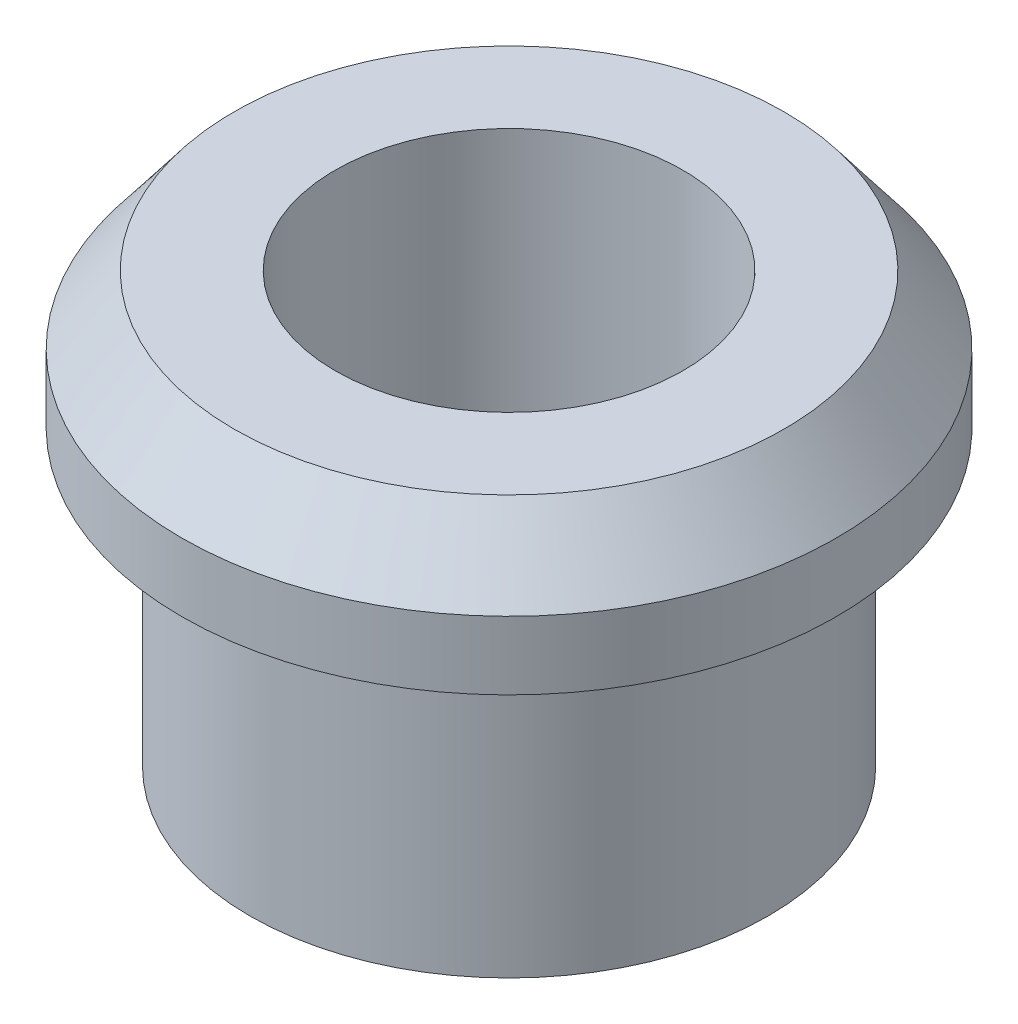
ISO-10303-21;
HEADER;
FILE_DESCRIPTION(('STEP AP214'),'2;1');
FILE_NAME('part.step','',(''),(''),'','','');
FILE_SCHEMA(('AUTOMOTIVE_DESIGN { 1 0 10303 214 1 1 1 1 }'));
ENDSEC;
DATA;
#1=APPLICATION_CONTEXT('core data for automotive mechanical design processes');
#2=APPLICATION_PROTOCOL_DEFINITION('international standard','automotive_design',2000,#1);
#3=PRODUCT_CONTEXT('',#1,'mechanical');
#4=PRODUCT('Part','Part','',(#3));
#5=PRODUCT_RELATED_PRODUCT_CATEGORY('part','',(#4));
#6=PRODUCT_DEFINITION_FORMATION('','',#4);
#7=PRODUCT_DEFINITION_CONTEXT('part definition',#1,'design');
#8=PRODUCT_DEFINITION('design','',#6,#7);
#9=PRODUCT_DEFINITION_SHAPE('','',#8);
#10=(LENGTH_UNIT() NAMED_UNIT(*) SI_UNIT(.MILLI.,.METRE.));
#11=(NAMED_UNIT(*) PLANE_ANGLE_UNIT() SI_UNIT($,.RADIAN.));
#12=(NAMED_UNIT(*) SI_UNIT($,.STERADIAN.) SOLID_ANGLE_UNIT());
#13=UNCERTAINTY_MEASURE_WITH_UNIT(LENGTH_MEASURE(1.E-05),#10,'distance_accuracy_value','');
#14=(GEOMETRIC_REPRESENTATION_CONTEXT(3) GLOBAL_UNCERTAINTY_ASSIGNED_CONTEXT((#13)) GLOBAL_UNIT_ASSIGNED_CONTEXT((#10,
#11,#12)) REPRESENTATION_CONTEXT('',''));
#15=CARTESIAN_POINT('',(0.,0.,0.));
#16=DIRECTION('',(0.,0.,1.));
#17=DIRECTION('',(1.,0.,0.));
#18=AXIS2_PLACEMENT_3D('',#15,#16,#17);
#19=CARTESIAN_POINT('',(0.,3.84731065352995,0.));
#20=DIRECTION('',(0.,-1.,0.));
#21=DIRECTION('',(0.,0.,-1.));
#22=AXIS2_PLACEMENT_3D('',#19,#20,#21);
#23=CONICAL_SURFACE('',#22,7.9375,0.655695626241537);
#24=CARTESIAN_POINT('',(0.,5.49831065352995,0.));
#25=DIRECTION('',(0.,1.,0.));
#26=DIRECTION('',(0.,0.,1.));
#27=AXIS2_PLACEMENT_3D('',#24,#25,#26);
#28=CIRCLE('',#27,6.6675);
#29=CARTESIAN_POINT('',(0.,5.49831065352995,6.6675));
#30=VERTEX_POINT('',#29);
#31=EDGE_CURVE('E71',#30,#30,#28,.T.);
#32=ORIENTED_EDGE('',*,*,#31,.F.);
#33=EDGE_LOOP('',(#32));
#34=FACE_BOUND('',#33,.T.);
#35=CARTESIAN_POINT('',(0.,3.84731065352995,0.));
#36=DIRECTION('',(0.,1.,0.));
#37=DIRECTION('',(0.,0.,1.));
#38=AXIS2_PLACEMENT_3D('',#35,#36,#37);
#39=CIRCLE('',#38,7.9375);
#40=CARTESIAN_POINT('',(0.,3.84731065352995,7.9375));
#41=VERTEX_POINT('',#40);
#42=EDGE_CURVE('E66',#41,#41,#39,.T.);
#43=ORIENTED_EDGE('',*,*,#42,.T.);
#44=EDGE_LOOP('',(#43));
#45=FACE_BOUND('',#44,.T.);
#46=ADVANCED_FACE('F51',(#34,#45),#23,.T.);
#47=CARTESIAN_POINT('',(0.,5.49831065352995,0.));
#48=DIRECTION('',(0.,-1.,0.));
#49=DIRECTION('',(0.,0.,-1.));
#50=AXIS2_PLACEMENT_3D('',#47,#48,#49);
#51=PLANE('',#50);
#52=CARTESIAN_POINT('',(0.,5.49831065352995,0.));
#53=DIRECTION('',(0.,1.,0.));
#54=DIRECTION('',(0.,0.,1.));
#55=AXIS2_PLACEMENT_3D('',#52,#53,#54);
#56=CIRCLE('',#55,4.21639999999999);
#57=CARTESIAN_POINT('',(0.,5.49831065352995,4.21639999999999));
#58=VERTEX_POINT('',#57);
#59=EDGE_CURVE('E77',#58,#58,#56,.T.);
#60=ORIENTED_EDGE('',*,*,#59,.F.);
#61=EDGE_LOOP('',(#60));
#62=FACE_BOUND('',#61,.T.);
#63=ORIENTED_EDGE('',*,*,#31,.T.);
#64=EDGE_LOOP('',(#63));
#65=FACE_BOUND('',#64,.T.);
#66=ADVANCED_FACE('F83',(#62,#65),#51,.F.);
#67=CARTESIAN_POINT('',(0.,5.49831065352995,0.));
#68=DIRECTION('',(0.,1.,0.));
#69=DIRECTION('',(0.,0.,1.));
#70=AXIS2_PLACEMENT_3D('',#67,#68,#69);
#71=CYLINDRICAL_SURFACE('',#70,7.9375);
#72=ORIENTED_EDGE('',*,*,#42,.F.);
#73=EDGE_LOOP('',(#72));
#74=FACE_BOUND('',#73,.T.);
#75=CARTESIAN_POINT('',(0.,2.19631065352995,0.));
#76=DIRECTION('',(0.,1.,0.));
#77=DIRECTION('',(0.,0.,1.));
#78=AXIS2_PLACEMENT_3D('',#75,#76,#77);
#79=CIRCLE('',#78,7.9375);
#80=CARTESIAN_POINT('',(0.,2.19631065352995,7.9375));
#81=VERTEX_POINT('',#80);
#82=EDGE_CURVE('E62',#81,#81,#79,.T.);
#83=ORIENTED_EDGE('',*,*,#82,.T.);
#84=EDGE_LOOP('',(#83));
#85=FACE_BOUND('',#84,.T.);
#86=ADVANCED_FACE('F86',(#74,#85),#71,.T.);
#87=CARTESIAN_POINT('',(0.,2.19631065352995,0.));
#88=DIRECTION('',(0.,1.,0.));
#89=DIRECTION('',(0.,0.,1.));
#90=AXIS2_PLACEMENT_3D('',#87,#88,#89);
#91=PLANE('',#90);
#92=ORIENTED_EDGE('',*,*,#82,.F.);
#93=EDGE_LOOP('',(#92));
#94=FACE_BOUND('',#93,.T.);
#95=CARTESIAN_POINT('',(0.,2.19631065352995,0.));
#96=DIRECTION('',(0.,1.,0.));
#97=DIRECTION('',(0.,0.,1.));
#98=AXIS2_PLACEMENT_3D('',#95,#96,#97);
#99=CIRCLE('',#98,6.2865);
#100=CARTESIAN_POINT('',(0.,2.19631065352995,6.2865));
#101=VERTEX_POINT('',#100);
#102=EDGE_CURVE('E58',#101,#101,#99,.T.);
#103=ORIENTED_EDGE('',*,*,#102,.T.);
#104=EDGE_LOOP('',(#103));
#105=FACE_BOUND('',#104,.T.);
#106=ADVANCED_FACE('F97',(#94,#105),#91,.F.);
#107=CARTESIAN_POINT('',(0.,5.49831065352995,0.));
#108=DIRECTION('',(0.,1.,0.));
#109=DIRECTION('',(0.,0.,1.));
#110=AXIS2_PLACEMENT_3D('',#107,#108,#109);
#111=CYLINDRICAL_SURFACE('',#110,6.2865);
#112=ORIENTED_EDGE('',*,*,#102,.F.);
#113=EDGE_LOOP('',(#112));
#114=FACE_BOUND('',#113,.T.);
#115=CARTESIAN_POINT('',(0.,-4.91568934647005,0.));
#116=DIRECTION('',(0.,1.,0.));
#117=DIRECTION('',(0.,0.,1.));
#118=AXIS2_PLACEMENT_3D('',#115,#116,#117);
#119=CIRCLE('',#118,6.2865);
#120=CARTESIAN_POINT('',(0.,-4.91568934647005,6.2865));
#121=VERTEX_POINT('',#120);
#122=EDGE_CURVE('E10',#121,#121,#119,.T.);
#123=ORIENTED_EDGE('',*,*,#122,.T.);
#124=EDGE_LOOP('',(#123));
#125=FACE_BOUND('',#124,.T.);
#126=ADVANCED_FACE('F102',(#114,#125),#111,.T.);
#127=CARTESIAN_POINT('',(0.,-4.91568934647005,0.));
#128=DIRECTION('',(0.,1.,0.));
#129=DIRECTION('',(0.,0.,1.));
#130=AXIS2_PLACEMENT_3D('',#127,#128,#129);
#131=PLANE('',#130);
#132=CARTESIAN_POINT('',(0.,-4.91568934647005,0.));
#133=DIRECTION('',(0.,1.,0.));
#134=DIRECTION('',(0.,0.,1.));
#135=AXIS2_PLACEMENT_3D('',#132,#133,#134);
#136=CIRCLE('',#135,4.2164);
#137=CARTESIAN_POINT('',(0.,-4.91568934647005,4.2164));
#138=VERTEX_POINT('',#137);
#139=EDGE_CURVE('E74',#138,#138,#136,.T.);
#140=ORIENTED_EDGE('',*,*,#139,.T.);
#141=EDGE_LOOP('',(#140));
#142=FACE_BOUND('',#141,.T.);
#143=ORIENTED_EDGE('',*,*,#122,.F.);
#144=EDGE_LOOP('',(#143));
#145=FACE_BOUND('',#144,.T.);
#146=ADVANCED_FACE('F53',(#142,#145),#131,.F.);
#147=CARTESIAN_POINT('',(0.,5.49831065352995,0.));
#148=DIRECTION('',(0.,1.,0.));
#149=DIRECTION('',(0.,0.,1.));
#150=AXIS2_PLACEMENT_3D('',#147,#148,#149);
#151=CYLINDRICAL_SURFACE('',#150,4.21639999999999);
#152=ORIENTED_EDGE('',*,*,#139,.F.);
#153=EDGE_LOOP('',(#152));
#154=FACE_BOUND('',#153,.T.);
#155=ORIENTED_EDGE('',*,*,#59,.T.);
#156=EDGE_LOOP('',(#155));
#157=FACE_BOUND('',#156,.T.);
#158=ADVANCED_FACE('F81',(#154,#157),#151,.F.);
#159=CLOSED_SHELL('',(#46,#66,#86,#106,#126,#146,#158));
#160=MANIFOLD_SOLID_BREP('B2',#159);
#161=ADVANCED_BREP_SHAPE_REPRESENTATION('',(#18,#160),#14);
#162=SHAPE_DEFINITION_REPRESENTATION(#9,#161);
ENDSEC;
END-ISO-10303-21;
